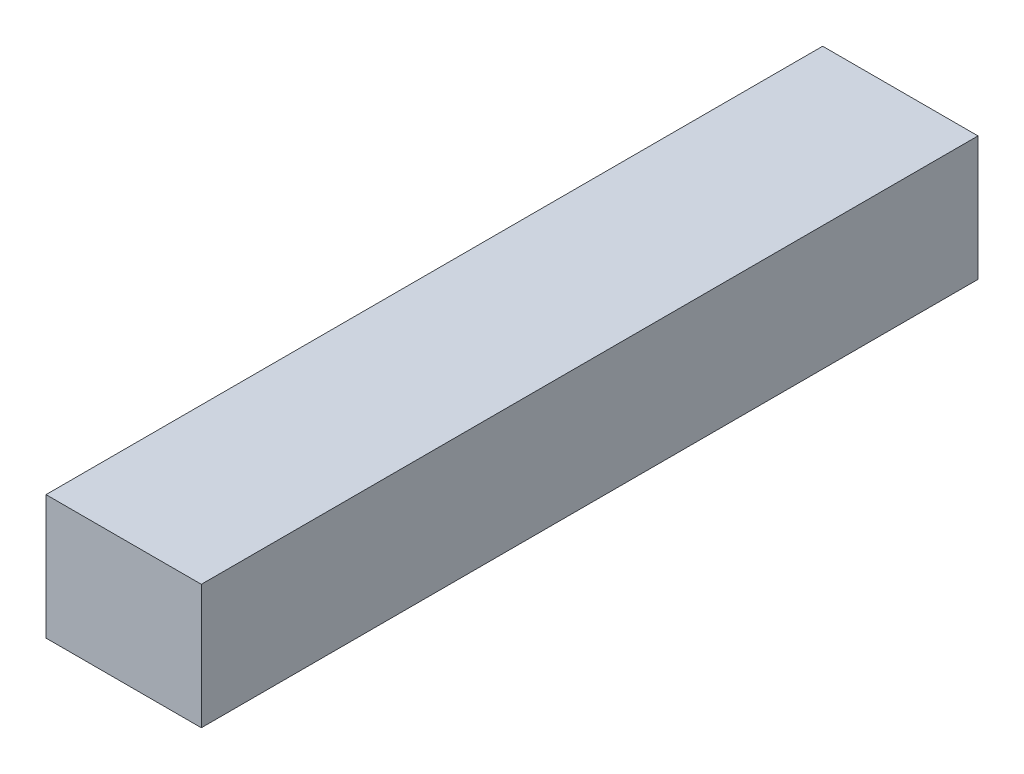
ISO-10303-21;
HEADER;
FILE_DESCRIPTION(('STEP AP214'),'2;1');
FILE_NAME('part.step','',(''),(''),'','','');
FILE_SCHEMA(('AUTOMOTIVE_DESIGN { 1 0 10303 214 1 1 1 1 }'));
ENDSEC;
DATA;
#1=APPLICATION_CONTEXT('core data for automotive mechanical design processes');
#2=APPLICATION_PROTOCOL_DEFINITION('international standard','automotive_design',2000,#1);
#3=PRODUCT_CONTEXT('',#1,'mechanical');
#4=PRODUCT('Part','Part','',(#3));
#5=PRODUCT_RELATED_PRODUCT_CATEGORY('part','',(#4));
#6=PRODUCT_DEFINITION_FORMATION('','',#4);
#7=PRODUCT_DEFINITION_CONTEXT('part definition',#1,'design');
#8=PRODUCT_DEFINITION('design','',#6,#7);
#9=PRODUCT_DEFINITION_SHAPE('','',#8);
#10=(LENGTH_UNIT() NAMED_UNIT(*) SI_UNIT(.MILLI.,.METRE.));
#11=(NAMED_UNIT(*) PLANE_ANGLE_UNIT() SI_UNIT($,.RADIAN.));
#12=(NAMED_UNIT(*) SI_UNIT($,.STERADIAN.) SOLID_ANGLE_UNIT());
#13=UNCERTAINTY_MEASURE_WITH_UNIT(LENGTH_MEASURE(1.E-05),#10,'distance_accuracy_value','');
#14=(GEOMETRIC_REPRESENTATION_CONTEXT(3) GLOBAL_UNCERTAINTY_ASSIGNED_CONTEXT((#13)) GLOBAL_UNIT_ASSIGNED_CONTEXT((#10,
#11,#12)) REPRESENTATION_CONTEXT('',''));
#15=CARTESIAN_POINT('',(0.,0.,0.));
#16=DIRECTION('',(0.,0.,1.));
#17=DIRECTION('',(1.,0.,0.));
#18=AXIS2_PLACEMENT_3D('',#15,#16,#17);
#19=CARTESIAN_POINT('',(3.,-2.4,-30.));
#20=DIRECTION('',(1.,0.,0.));
#21=DIRECTION('',(0.,0.,-1.));
#22=AXIS2_PLACEMENT_3D('',#19,#20,#21);
#23=PLANE('',#22);
#24=DIRECTION('',(0.,1.,0.));
#25=VECTOR('',#24,1.);
#26=CARTESIAN_POINT('',(3.,-2.4,0.));
#27=LINE('',#26,#25);
#28=CARTESIAN_POINT('',(3.,-2.4,0.));
#29=VERTEX_POINT('',#28);
#30=CARTESIAN_POINT('',(3.,2.4,0.));
#31=VERTEX_POINT('',#30);
#32=EDGE_CURVE('E103',#29,#31,#27,.T.);
#33=ORIENTED_EDGE('',*,*,#32,.F.);
#34=DIRECTION('',(0.,0.,1.));
#35=VECTOR('',#34,1.);
#36=CARTESIAN_POINT('',(3.,-2.4,-30.));
#37=LINE('',#36,#35);
#38=CARTESIAN_POINT('',(3.,-2.4,-30.));
#39=VERTEX_POINT('',#38);
#40=EDGE_CURVE('E11',#39,#29,#37,.T.);
#41=ORIENTED_EDGE('',*,*,#40,.F.);
#42=DIRECTION('',(0.,1.,0.));
#43=VECTOR('',#42,1.);
#44=CARTESIAN_POINT('',(3.,-2.4,-30.));
#45=LINE('',#44,#43);
#46=CARTESIAN_POINT('',(3.,2.4,-30.));
#47=VERTEX_POINT('',#46);
#48=EDGE_CURVE('E97',#39,#47,#45,.T.);
#49=ORIENTED_EDGE('',*,*,#48,.T.);
#50=DIRECTION('',(0.,0.,1.));
#51=VECTOR('',#50,1.);
#52=CARTESIAN_POINT('',(3.,2.4,-30.));
#53=LINE('',#52,#51);
#54=EDGE_CURVE('E42',#47,#31,#53,.T.);
#55=ORIENTED_EDGE('',*,*,#54,.T.);
#56=EDGE_LOOP('',(#33,#41,#49,#55));
#57=FACE_BOUND('',#56,.T.);
#58=ADVANCED_FACE('F39',(#57),#23,.T.);
#59=CARTESIAN_POINT('',(-3.,-2.4,-30.));
#60=DIRECTION('',(0.,-1.,0.));
#61=DIRECTION('',(0.,0.,-1.));
#62=AXIS2_PLACEMENT_3D('',#59,#60,#61);
#63=PLANE('',#62);
#64=DIRECTION('',(1.,0.,0.));
#65=VECTOR('',#64,1.);
#66=CARTESIAN_POINT('',(-3.,-2.4,0.));
#67=LINE('',#66,#65);
#68=CARTESIAN_POINT('',(-3.,-2.4,0.));
#69=VERTEX_POINT('',#68);
#70=EDGE_CURVE('E99',#69,#29,#67,.T.);
#71=ORIENTED_EDGE('',*,*,#70,.F.);
#72=DIRECTION('',(0.,0.,1.));
#73=VECTOR('',#72,1.);
#74=CARTESIAN_POINT('',(-3.,-2.4,-30.));
#75=LINE('',#74,#73);
#76=CARTESIAN_POINT('',(-3.,-2.4,-30.));
#77=VERTEX_POINT('',#76);
#78=EDGE_CURVE('E48',#77,#69,#75,.T.);
#79=ORIENTED_EDGE('',*,*,#78,.F.);
#80=DIRECTION('',(1.,0.,0.));
#81=VECTOR('',#80,1.);
#82=CARTESIAN_POINT('',(-3.,-2.4,-30.));
#83=LINE('',#82,#81);
#84=EDGE_CURVE('E94',#77,#39,#83,.T.);
#85=ORIENTED_EDGE('',*,*,#84,.T.);
#86=ORIENTED_EDGE('',*,*,#40,.T.);
#87=EDGE_LOOP('',(#71,#79,#85,#86));
#88=FACE_BOUND('',#87,.T.);
#89=ADVANCED_FACE('F113',(#88),#63,.T.);
#90=CARTESIAN_POINT('',(-3.,-2.4,-30.));
#91=DIRECTION('',(-1.,0.,0.));
#92=DIRECTION('',(0.,0.,1.));
#93=AXIS2_PLACEMENT_3D('',#90,#91,#92);
#94=PLANE('',#93);
#95=DIRECTION('',(0.,-1.,0.));
#96=VECTOR('',#95,1.);
#97=CARTESIAN_POINT('',(-3.,-2.4,0.));
#98=LINE('',#97,#96);
#99=CARTESIAN_POINT('',(-3.,2.4,0.));
#100=VERTEX_POINT('',#99);
#101=EDGE_CURVE('E89',#100,#69,#98,.T.);
#102=ORIENTED_EDGE('',*,*,#101,.F.);
#103=DIRECTION('',(0.,0.,1.));
#104=VECTOR('',#103,1.);
#105=CARTESIAN_POINT('',(-3.,2.4,-30.));
#106=LINE('',#105,#104);
#107=CARTESIAN_POINT('',(-3.,2.4,-30.));
#108=VERTEX_POINT('',#107);
#109=EDGE_CURVE('E84',#108,#100,#106,.T.);
#110=ORIENTED_EDGE('',*,*,#109,.F.);
#111=DIRECTION('',(0.,-1.,0.));
#112=VECTOR('',#111,1.);
#113=CARTESIAN_POINT('',(-3.,-2.4,-30.));
#114=LINE('',#113,#112);
#115=EDGE_CURVE('E87',#108,#77,#114,.T.);
#116=ORIENTED_EDGE('',*,*,#115,.T.);
#117=ORIENTED_EDGE('',*,*,#78,.T.);
#118=EDGE_LOOP('',(#102,#110,#116,#117));
#119=FACE_BOUND('',#118,.T.);
#120=ADVANCED_FACE('F86',(#119),#94,.T.);
#121=CARTESIAN_POINT('',(-3.,2.4,-30.));
#122=DIRECTION('',(0.,1.,0.));
#123=DIRECTION('',(0.,0.,1.));
#124=AXIS2_PLACEMENT_3D('',#121,#122,#123);
#125=PLANE('',#124);
#126=DIRECTION('',(-1.,0.,0.));
#127=VECTOR('',#126,1.);
#128=CARTESIAN_POINT('',(-3.,2.4,0.));
#129=LINE('',#128,#127);
#130=EDGE_CURVE('E106',#31,#100,#129,.T.);
#131=ORIENTED_EDGE('',*,*,#130,.F.);
#132=ORIENTED_EDGE('',*,*,#54,.F.);
#133=DIRECTION('',(-1.,0.,0.));
#134=VECTOR('',#133,1.);
#135=CARTESIAN_POINT('',(-3.,2.4,-30.));
#136=LINE('',#135,#134);
#137=EDGE_CURVE('E93',#47,#108,#136,.T.);
#138=ORIENTED_EDGE('',*,*,#137,.T.);
#139=ORIENTED_EDGE('',*,*,#109,.T.);
#140=EDGE_LOOP('',(#131,#132,#138,#139));
#141=FACE_BOUND('',#140,.T.);
#142=ADVANCED_FACE('F96',(#141),#125,.T.);
#143=CARTESIAN_POINT('',(0.,0.,-30.));
#144=DIRECTION('',(0.,0.,-1.));
#145=DIRECTION('',(-1.,0.,0.));
#146=AXIS2_PLACEMENT_3D('',#143,#144,#145);
#147=PLANE('',#146);
#148=ORIENTED_EDGE('',*,*,#48,.F.);
#149=ORIENTED_EDGE('',*,*,#84,.F.);
#150=ORIENTED_EDGE('',*,*,#115,.F.);
#151=ORIENTED_EDGE('',*,*,#137,.F.);
#152=EDGE_LOOP('',(#148,#149,#150,#151));
#153=FACE_BOUND('',#152,.T.);
#154=ADVANCED_FACE('F92',(#153),#147,.T.);
#155=CARTESIAN_POINT('',(0.,0.,0.));
#156=DIRECTION('',(0.,0.,-1.));
#157=DIRECTION('',(-1.,0.,0.));
#158=AXIS2_PLACEMENT_3D('',#155,#156,#157);
#159=PLANE('',#158);
#160=ORIENTED_EDGE('',*,*,#32,.T.);
#161=ORIENTED_EDGE('',*,*,#130,.T.);
#162=ORIENTED_EDGE('',*,*,#101,.T.);
#163=ORIENTED_EDGE('',*,*,#70,.T.);
#164=EDGE_LOOP('',(#160,#161,#162,#163));
#165=FACE_BOUND('',#164,.T.);
#166=ADVANCED_FACE('F112',(#165),#159,.F.);
#167=CLOSED_SHELL('',(#58,#89,#120,#142,#154,#166));
#168=MANIFOLD_SOLID_BREP('B2',#167);
#169=ADVANCED_BREP_SHAPE_REPRESENTATION('',(#18,#168),#14);
#170=SHAPE_DEFINITION_REPRESENTATION(#9,#169);
ENDSEC;
END-ISO-10303-21;
